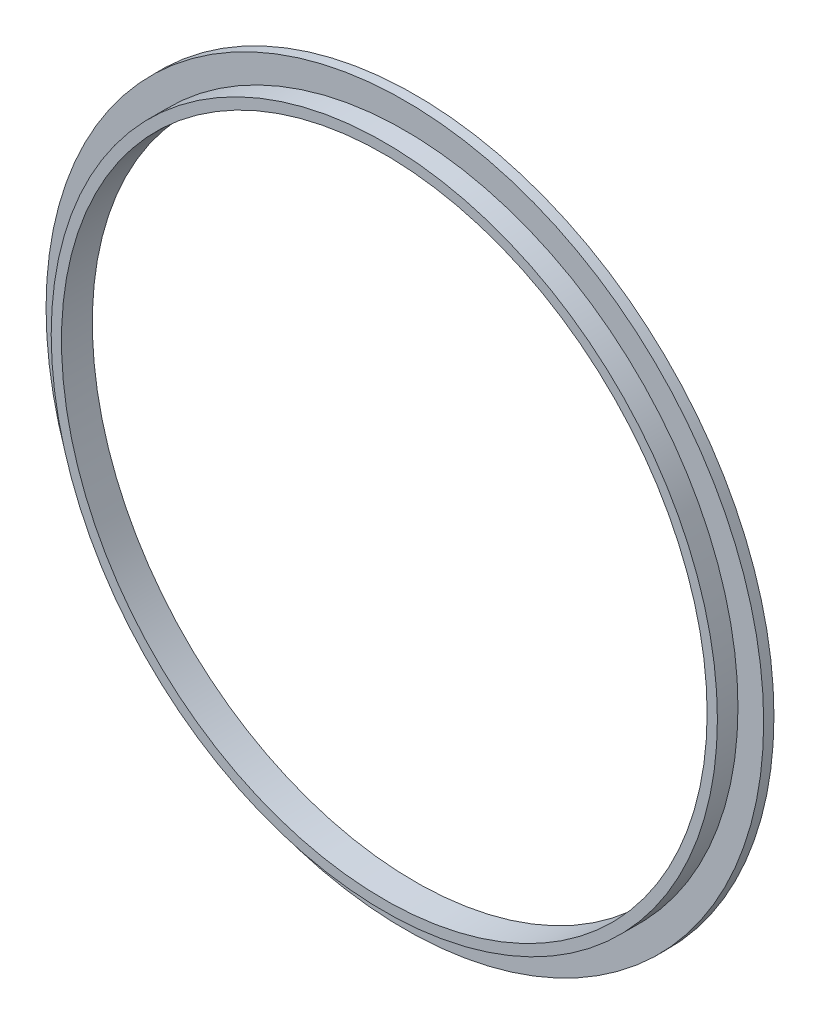
ISO-10303-21;
HEADER;
FILE_DESCRIPTION(('STEP AP214'),'2;1');
FILE_NAME('part.step','',(''),(''),'','','');
FILE_SCHEMA(('AUTOMOTIVE_DESIGN { 1 0 10303 214 1 1 1 1 }'));
ENDSEC;
DATA;
#1=APPLICATION_CONTEXT('core data for automotive mechanical design processes');
#2=APPLICATION_PROTOCOL_DEFINITION('international standard','automotive_design',2000,#1);
#3=PRODUCT_CONTEXT('',#1,'mechanical');
#4=PRODUCT('Part','Part','',(#3));
#5=PRODUCT_RELATED_PRODUCT_CATEGORY('part','',(#4));
#6=PRODUCT_DEFINITION_FORMATION('','',#4);
#7=PRODUCT_DEFINITION_CONTEXT('part definition',#1,'design');
#8=PRODUCT_DEFINITION('design','',#6,#7);
#9=PRODUCT_DEFINITION_SHAPE('','',#8);
#10=(LENGTH_UNIT() NAMED_UNIT(*) SI_UNIT(.MILLI.,.METRE.));
#11=(NAMED_UNIT(*) PLANE_ANGLE_UNIT() SI_UNIT($,.RADIAN.));
#12=(NAMED_UNIT(*) SI_UNIT($,.STERADIAN.) SOLID_ANGLE_UNIT());
#13=UNCERTAINTY_MEASURE_WITH_UNIT(LENGTH_MEASURE(1.E-05),#10,'distance_accuracy_value','');
#14=(GEOMETRIC_REPRESENTATION_CONTEXT(3) GLOBAL_UNCERTAINTY_ASSIGNED_CONTEXT((#13)) GLOBAL_UNIT_ASSIGNED_CONTEXT((#10,
#11,#12)) REPRESENTATION_CONTEXT('',''));
#15=CARTESIAN_POINT('',(0.,0.,0.));
#16=DIRECTION('',(0.,0.,1.));
#17=DIRECTION('',(1.,0.,0.));
#18=AXIS2_PLACEMENT_3D('',#15,#16,#17);
#19=CARTESIAN_POINT('',(0.,0.,2.));
#20=DIRECTION('',(0.,0.,1.));
#21=DIRECTION('',(1.,0.,0.));
#22=AXIS2_PLACEMENT_3D('',#19,#20,#21);
#23=PLANE('',#22);
#24=CARTESIAN_POINT('',(0.,0.,2.));
#25=DIRECTION('',(0.,0.,1.));
#26=DIRECTION('',(1.,0.,0.));
#27=AXIS2_PLACEMENT_3D('',#24,#25,#26);
#28=CIRCLE('',#27,69.8);
#29=CARTESIAN_POINT('',(69.8,0.,2.));
#30=VERTEX_POINT('',#29);
#31=EDGE_CURVE('E10',#30,#30,#28,.T.);
#32=ORIENTED_EDGE('',*,*,#31,.T.);
#33=EDGE_LOOP('',(#32));
#34=FACE_BOUND('',#33,.T.);
#35=CARTESIAN_POINT('',(0.,0.,2.));
#36=DIRECTION('',(0.,0.,1.));
#37=DIRECTION('',(1.,0.,0.));
#38=AXIS2_PLACEMENT_3D('',#35,#36,#37);
#39=CIRCLE('',#38,64.8);
#40=CARTESIAN_POINT('',(64.8,0.,2.));
#41=VERTEX_POINT('',#40);
#42=EDGE_CURVE('E60',#41,#41,#39,.T.);
#43=ORIENTED_EDGE('',*,*,#42,.F.);
#44=EDGE_LOOP('',(#43));
#45=FACE_BOUND('',#44,.T.);
#46=ADVANCED_FACE('F41',(#34,#45),#23,.T.);
#47=CARTESIAN_POINT('',(0.,0.,0.));
#48=DIRECTION('',(0.,0.,1.));
#49=DIRECTION('',(1.,0.,0.));
#50=AXIS2_PLACEMENT_3D('',#47,#48,#49);
#51=PLANE('',#50);
#52=CARTESIAN_POINT('',(0.,0.,0.));
#53=DIRECTION('',(0.,0.,1.));
#54=DIRECTION('',(1.,0.,0.));
#55=AXIS2_PLACEMENT_3D('',#52,#53,#54);
#56=CIRCLE('',#55,69.8);
#57=CARTESIAN_POINT('',(69.8,0.,0.));
#58=VERTEX_POINT('',#57);
#59=EDGE_CURVE('E45',#58,#58,#56,.T.);
#60=ORIENTED_EDGE('',*,*,#59,.F.);
#61=EDGE_LOOP('',(#60));
#62=FACE_BOUND('',#61,.T.);
#63=CARTESIAN_POINT('',(0.,0.,0.));
#64=DIRECTION('',(0.,0.,1.));
#65=DIRECTION('',(1.,0.,0.));
#66=AXIS2_PLACEMENT_3D('',#63,#64,#65);
#67=CIRCLE('',#66,62.8);
#68=CARTESIAN_POINT('',(62.8,0.,0.));
#69=VERTEX_POINT('',#68);
#70=EDGE_CURVE('E54',#69,#69,#67,.T.);
#71=ORIENTED_EDGE('',*,*,#70,.T.);
#72=EDGE_LOOP('',(#71));
#73=FACE_BOUND('',#72,.T.);
#74=ADVANCED_FACE('F88',(#62,#73),#51,.F.);
#75=CARTESIAN_POINT('',(0.,0.,2.));
#76=DIRECTION('',(0.,0.,-1.));
#77=DIRECTION('',(-1.,0.,0.));
#78=AXIS2_PLACEMENT_3D('',#75,#76,#77);
#79=CYLINDRICAL_SURFACE('',#78,69.8);
#80=ORIENTED_EDGE('',*,*,#31,.F.);
#81=EDGE_LOOP('',(#80));
#82=FACE_BOUND('',#81,.T.);
#83=ORIENTED_EDGE('',*,*,#59,.T.);
#84=EDGE_LOOP('',(#83));
#85=FACE_BOUND('',#84,.T.);
#86=ADVANCED_FACE('F43',(#82,#85),#79,.T.);
#87=CARTESIAN_POINT('',(0.,0.,2.));
#88=DIRECTION('',(0.,0.,-1.));
#89=DIRECTION('',(-1.,0.,0.));
#90=AXIS2_PLACEMENT_3D('',#87,#88,#89);
#91=CYLINDRICAL_SURFACE('',#90,62.8);
#92=ORIENTED_EDGE('',*,*,#70,.F.);
#93=EDGE_LOOP('',(#92));
#94=FACE_BOUND('',#93,.T.);
#95=CARTESIAN_POINT('',(0.,0.,6.));
#96=DIRECTION('',(0.,0.,1.));
#97=DIRECTION('',(1.,0.,0.));
#98=AXIS2_PLACEMENT_3D('',#95,#96,#97);
#99=CIRCLE('',#98,62.8);
#100=CARTESIAN_POINT('',(62.8,0.,6.));
#101=VERTEX_POINT('',#100);
#102=EDGE_CURVE('E64',#101,#101,#99,.T.);
#103=ORIENTED_EDGE('',*,*,#102,.T.);
#104=EDGE_LOOP('',(#103));
#105=FACE_BOUND('',#104,.T.);
#106=ADVANCED_FACE('F72',(#94,#105),#91,.F.);
#107=CARTESIAN_POINT('',(0.,0.,6.));
#108=DIRECTION('',(0.,0.,1.));
#109=DIRECTION('',(1.,0.,0.));
#110=AXIS2_PLACEMENT_3D('',#107,#108,#109);
#111=PLANE('',#110);
#112=CARTESIAN_POINT('',(0.,0.,6.));
#113=DIRECTION('',(0.,0.,1.));
#114=DIRECTION('',(1.,0.,0.));
#115=AXIS2_PLACEMENT_3D('',#112,#113,#114);
#116=CIRCLE('',#115,64.8);
#117=CARTESIAN_POINT('',(64.8,0.,6.));
#118=VERTEX_POINT('',#117);
#119=EDGE_CURVE('E59',#118,#118,#116,.T.);
#120=ORIENTED_EDGE('',*,*,#119,.T.);
#121=EDGE_LOOP('',(#120));
#122=FACE_BOUND('',#121,.T.);
#123=ORIENTED_EDGE('',*,*,#102,.F.);
#124=EDGE_LOOP('',(#123));
#125=FACE_BOUND('',#124,.T.);
#126=ADVANCED_FACE('F74',(#122,#125),#111,.T.);
#127=CARTESIAN_POINT('',(0.,0.,6.));
#128=DIRECTION('',(0.,0.,-1.));
#129=DIRECTION('',(-1.,0.,0.));
#130=AXIS2_PLACEMENT_3D('',#127,#128,#129);
#131=CYLINDRICAL_SURFACE('',#130,64.8);
#132=ORIENTED_EDGE('',*,*,#119,.F.);
#133=EDGE_LOOP('',(#132));
#134=FACE_BOUND('',#133,.T.);
#135=ORIENTED_EDGE('',*,*,#42,.T.);
#136=EDGE_LOOP('',(#135));
#137=FACE_BOUND('',#136,.T.);
#138=ADVANCED_FACE('F76',(#134,#137),#131,.T.);
#139=CLOSED_SHELL('',(#46,#74,#86,#106,#126,#138));
#140=MANIFOLD_SOLID_BREP('B2',#139);
#141=ADVANCED_BREP_SHAPE_REPRESENTATION('',(#18,#140),#14);
#142=SHAPE_DEFINITION_REPRESENTATION(#9,#141);
ENDSEC;
END-ISO-10303-21;
